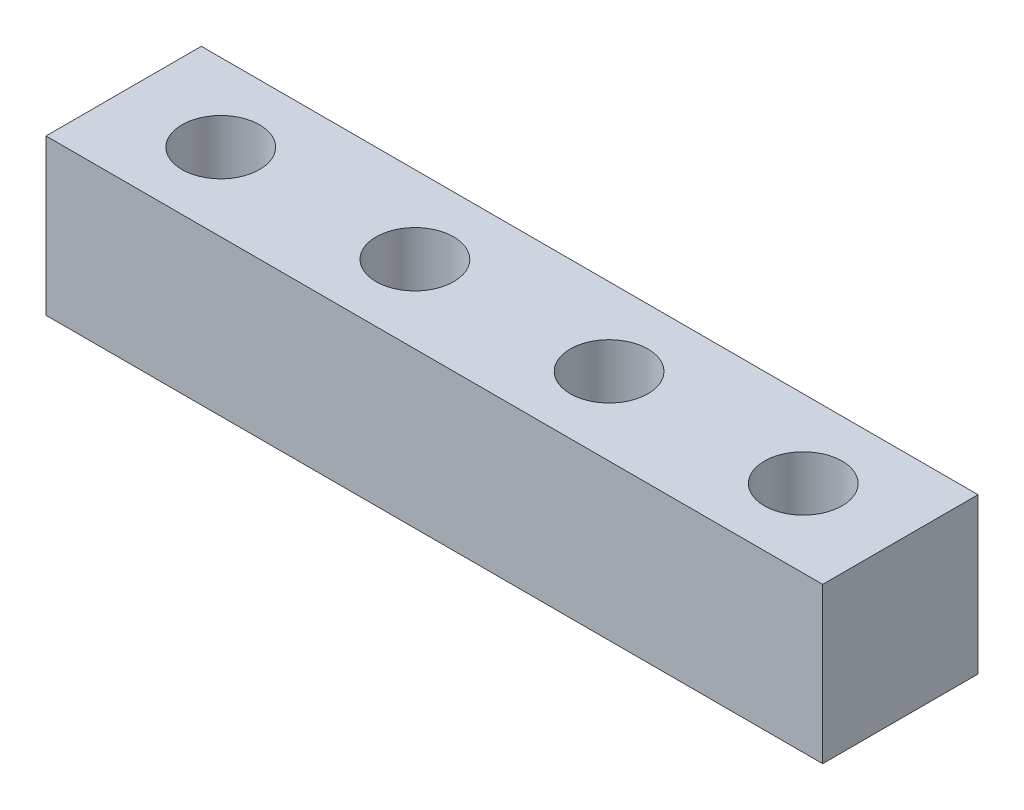
ISO-10303-21;
HEADER;
FILE_DESCRIPTION(('STEP AP214'),'2;1');
FILE_NAME('part.step','',(''),(''),'','','');
FILE_SCHEMA(('AUTOMOTIVE_DESIGN { 1 0 10303 214 1 1 1 1 }'));
ENDSEC;
DATA;
#1=APPLICATION_CONTEXT('core data for automotive mechanical design processes');
#2=APPLICATION_PROTOCOL_DEFINITION('international standard','automotive_design',2000,#1);
#3=PRODUCT_CONTEXT('',#1,'mechanical');
#4=PRODUCT('Part','Part','',(#3));
#5=PRODUCT_RELATED_PRODUCT_CATEGORY('part','',(#4));
#6=PRODUCT_DEFINITION_FORMATION('','',#4);
#7=PRODUCT_DEFINITION_CONTEXT('part definition',#1,'design');
#8=PRODUCT_DEFINITION('design','',#6,#7);
#9=PRODUCT_DEFINITION_SHAPE('','',#8);
#10=(LENGTH_UNIT() NAMED_UNIT(*) SI_UNIT(.MILLI.,.METRE.));
#11=(NAMED_UNIT(*) PLANE_ANGLE_UNIT() SI_UNIT($,.RADIAN.));
#12=(NAMED_UNIT(*) SI_UNIT($,.STERADIAN.) SOLID_ANGLE_UNIT());
#13=UNCERTAINTY_MEASURE_WITH_UNIT(LENGTH_MEASURE(1.E-05),#10,'distance_accuracy_value','');
#14=(GEOMETRIC_REPRESENTATION_CONTEXT(3) GLOBAL_UNCERTAINTY_ASSIGNED_CONTEXT((#13)) GLOBAL_UNIT_ASSIGNED_CONTEXT((#10,
#11,#12)) REPRESENTATION_CONTEXT('',''));
#15=CARTESIAN_POINT('',(0.,0.,0.));
#16=DIRECTION('',(0.,0.,1.));
#17=DIRECTION('',(1.,0.,0.));
#18=AXIS2_PLACEMENT_3D('',#15,#16,#17);
#19=CARTESIAN_POINT('',(0.,3.,0.));
#20=DIRECTION('',(0.,-1.,0.));
#21=DIRECTION('',(0.,0.,-1.));
#22=AXIS2_PLACEMENT_3D('',#19,#20,#21);
#23=PLANE('',#22);
#24=DIRECTION('',(0.,0.,-1.));
#25=VECTOR('',#24,1.);
#26=CARTESIAN_POINT('',(7.5,3.,1.5));
#27=LINE('',#26,#25);
#28=CARTESIAN_POINT('',(7.5,3.,1.5));
#29=VERTEX_POINT('',#28);
#30=CARTESIAN_POINT('',(7.5,3.,-1.5));
#31=VERTEX_POINT('',#30);
#32=EDGE_CURVE('E92',#29,#31,#27,.T.);
#33=ORIENTED_EDGE('',*,*,#32,.T.);
#34=DIRECTION('',(-1.,0.,0.));
#35=VECTOR('',#34,1.);
#36=CARTESIAN_POINT('',(-7.5,3.,-1.5));
#37=LINE('',#36,#35);
#38=CARTESIAN_POINT('',(-7.5,3.,-1.5));
#39=VERTEX_POINT('',#38);
#40=EDGE_CURVE('E87',#31,#39,#37,.T.);
#41=ORIENTED_EDGE('',*,*,#40,.T.);
#42=DIRECTION('',(0.,0.,1.));
#43=VECTOR('',#42,1.);
#44=CARTESIAN_POINT('',(-7.5,3.,1.5));
#45=LINE('',#44,#43);
#46=CARTESIAN_POINT('',(-7.5,3.,1.5));
#47=VERTEX_POINT('',#46);
#48=EDGE_CURVE('E90',#39,#47,#45,.T.);
#49=ORIENTED_EDGE('',*,*,#48,.T.);
#50=DIRECTION('',(1.,0.,0.));
#51=VECTOR('',#50,1.);
#52=CARTESIAN_POINT('',(-7.5,3.,1.5));
#53=LINE('',#52,#51);
#54=EDGE_CURVE('E57',#47,#29,#53,.T.);
#55=ORIENTED_EDGE('',*,*,#54,.T.);
#56=EDGE_LOOP('',(#33,#41,#49,#55));
#57=FACE_BOUND('',#56,.T.);
#58=CARTESIAN_POINT('',(-5.625,3.,0.));
#59=DIRECTION('',(0.,1.,0.));
#60=DIRECTION('',(0.,0.,1.));
#61=AXIS2_PLACEMENT_3D('',#58,#59,#60);
#62=CIRCLE('',#61,0.75);
#63=CARTESIAN_POINT('',(-5.625,3.,0.75));
#64=VERTEX_POINT('',#63);
#65=EDGE_CURVE('E112',#64,#64,#62,.T.);
#66=ORIENTED_EDGE('',*,*,#65,.F.);
#67=EDGE_LOOP('',(#66));
#68=FACE_BOUND('',#67,.T.);
#69=CARTESIAN_POINT('',(-1.875,3.,0.));
#70=DIRECTION('',(0.,1.,0.));
#71=DIRECTION('',(0.,0.,1.));
#72=AXIS2_PLACEMENT_3D('',#69,#70,#71);
#73=CIRCLE('',#72,0.75);
#74=CARTESIAN_POINT('',(-1.875,3.,0.75));
#75=VERTEX_POINT('',#74);
#76=EDGE_CURVE('E134',#75,#75,#73,.T.);
#77=ORIENTED_EDGE('',*,*,#76,.F.);
#78=EDGE_LOOP('',(#77));
#79=FACE_BOUND('',#78,.T.);
#80=CARTESIAN_POINT('',(1.875,3.,0.));
#81=DIRECTION('',(0.,1.,0.));
#82=DIRECTION('',(0.,0.,1.));
#83=AXIS2_PLACEMENT_3D('',#80,#81,#82);
#84=CIRCLE('',#83,0.75);
#85=CARTESIAN_POINT('',(1.875,3.,0.75));
#86=VERTEX_POINT('',#85);
#87=EDGE_CURVE('E142',#86,#86,#84,.T.);
#88=ORIENTED_EDGE('',*,*,#87,.F.);
#89=EDGE_LOOP('',(#88));
#90=FACE_BOUND('',#89,.T.);
#91=CARTESIAN_POINT('',(5.625,3.,0.));
#92=DIRECTION('',(0.,1.,0.));
#93=DIRECTION('',(0.,0.,1.));
#94=AXIS2_PLACEMENT_3D('',#91,#92,#93);
#95=CIRCLE('',#94,0.75);
#96=CARTESIAN_POINT('',(5.625,3.,0.75));
#97=VERTEX_POINT('',#96);
#98=EDGE_CURVE('E150',#97,#97,#95,.T.);
#99=ORIENTED_EDGE('',*,*,#98,.F.);
#100=EDGE_LOOP('',(#99));
#101=FACE_BOUND('',#100,.T.);
#102=ADVANCED_FACE('F39',(#57,#68,#79,#90,#101),#23,.F.);
#103=CARTESIAN_POINT('',(0.,0.,0.));
#104=DIRECTION('',(0.,-1.,0.));
#105=DIRECTION('',(0.,0.,-1.));
#106=AXIS2_PLACEMENT_3D('',#103,#104,#105);
#107=PLANE('',#106);
#108=CARTESIAN_POINT('',(1.875,0.,0.));
#109=DIRECTION('',(0.,1.,0.));
#110=DIRECTION('',(0.,0.,1.));
#111=AXIS2_PLACEMENT_3D('',#108,#109,#110);
#112=CIRCLE('',#111,0.75);
#113=CARTESIAN_POINT('',(1.875,0.,0.75));
#114=VERTEX_POINT('',#113);
#115=EDGE_CURVE('E146',#114,#114,#112,.T.);
#116=ORIENTED_EDGE('',*,*,#115,.T.);
#117=EDGE_LOOP('',(#116));
#118=FACE_BOUND('',#117,.T.);
#119=CARTESIAN_POINT('',(-5.625,0.,0.));
#120=DIRECTION('',(0.,1.,0.));
#121=DIRECTION('',(0.,0.,1.));
#122=AXIS2_PLACEMENT_3D('',#119,#120,#121);
#123=CIRCLE('',#122,0.75);
#124=CARTESIAN_POINT('',(-5.625,0.,0.75));
#125=VERTEX_POINT('',#124);
#126=EDGE_CURVE('E130',#125,#125,#123,.T.);
#127=ORIENTED_EDGE('',*,*,#126,.T.);
#128=EDGE_LOOP('',(#127));
#129=FACE_BOUND('',#128,.T.);
#130=DIRECTION('',(0.,0.,-1.));
#131=VECTOR('',#130,1.);
#132=CARTESIAN_POINT('',(7.5,0.,1.5));
#133=LINE('',#132,#131);
#134=CARTESIAN_POINT('',(7.5,0.,1.5));
#135=VERTEX_POINT('',#134);
#136=CARTESIAN_POINT('',(7.5,0.,-1.5));
#137=VERTEX_POINT('',#136);
#138=EDGE_CURVE('E108',#135,#137,#133,.T.);
#139=ORIENTED_EDGE('',*,*,#138,.F.);
#140=DIRECTION('',(1.,0.,0.));
#141=VECTOR('',#140,1.);
#142=CARTESIAN_POINT('',(-7.5,0.,1.5));
#143=LINE('',#142,#141);
#144=CARTESIAN_POINT('',(-7.5,0.,1.5));
#145=VERTEX_POINT('',#144);
#146=EDGE_CURVE('E80',#145,#135,#143,.T.);
#147=ORIENTED_EDGE('',*,*,#146,.F.);
#148=DIRECTION('',(0.,0.,1.));
#149=VECTOR('',#148,1.);
#150=CARTESIAN_POINT('',(-7.5,0.,1.5));
#151=LINE('',#150,#149);
#152=CARTESIAN_POINT('',(-7.5,0.,-1.5));
#153=VERTEX_POINT('',#152);
#154=EDGE_CURVE('E74',#153,#145,#151,.T.);
#155=ORIENTED_EDGE('',*,*,#154,.F.);
#156=DIRECTION('',(-1.,0.,0.));
#157=VECTOR('',#156,1.);
#158=CARTESIAN_POINT('',(-7.5,0.,-1.5));
#159=LINE('',#158,#157);
#160=EDGE_CURVE('E97',#137,#153,#159,.T.);
#161=ORIENTED_EDGE('',*,*,#160,.F.);
#162=EDGE_LOOP('',(#139,#147,#155,#161));
#163=FACE_BOUND('',#162,.T.);
#164=CARTESIAN_POINT('',(-1.875,0.,0.));
#165=DIRECTION('',(0.,1.,0.));
#166=DIRECTION('',(0.,0.,1.));
#167=AXIS2_PLACEMENT_3D('',#164,#165,#166);
#168=CIRCLE('',#167,0.75);
#169=CARTESIAN_POINT('',(-1.875,0.,0.75));
#170=VERTEX_POINT('',#169);
#171=EDGE_CURVE('E138',#170,#170,#168,.T.);
#172=ORIENTED_EDGE('',*,*,#171,.T.);
#173=EDGE_LOOP('',(#172));
#174=FACE_BOUND('',#173,.T.);
#175=CARTESIAN_POINT('',(5.625,0.,0.));
#176=DIRECTION('',(0.,1.,0.));
#177=DIRECTION('',(0.,0.,1.));
#178=AXIS2_PLACEMENT_3D('',#175,#176,#177);
#179=CIRCLE('',#178,0.75);
#180=CARTESIAN_POINT('',(5.625,0.,0.75));
#181=VERTEX_POINT('',#180);
#182=EDGE_CURVE('E154',#181,#181,#179,.T.);
#183=ORIENTED_EDGE('',*,*,#182,.T.);
#184=EDGE_LOOP('',(#183));
#185=FACE_BOUND('',#184,.T.);
#186=ADVANCED_FACE('F125',(#118,#129,#163,#174,#185),#107,.T.);
#187=CARTESIAN_POINT('',(7.5,3.,1.5));
#188=DIRECTION('',(-1.,0.,0.));
#189=DIRECTION('',(0.,0.,1.));
#190=AXIS2_PLACEMENT_3D('',#187,#188,#189);
#191=PLANE('',#190);
#192=ORIENTED_EDGE('',*,*,#138,.T.);
#193=DIRECTION('',(0.,-1.,0.));
#194=VECTOR('',#193,1.);
#195=CARTESIAN_POINT('',(7.5,3.,-1.5));
#196=LINE('',#195,#194);
#197=EDGE_CURVE('E11',#31,#137,#196,.T.);
#198=ORIENTED_EDGE('',*,*,#197,.F.);
#199=ORIENTED_EDGE('',*,*,#32,.F.);
#200=DIRECTION('',(0.,-1.,0.));
#201=VECTOR('',#200,1.);
#202=CARTESIAN_POINT('',(7.5,3.,1.5));
#203=LINE('',#202,#201);
#204=EDGE_CURVE('E104',#29,#135,#203,.T.);
#205=ORIENTED_EDGE('',*,*,#204,.T.);
#206=EDGE_LOOP('',(#192,#198,#199,#205));
#207=FACE_BOUND('',#206,.T.);
#208=ADVANCED_FACE('F41',(#207),#191,.F.);
#209=CARTESIAN_POINT('',(-7.5,3.,-1.5));
#210=DIRECTION('',(0.,0.,1.));
#211=DIRECTION('',(1.,0.,0.));
#212=AXIS2_PLACEMENT_3D('',#209,#210,#211);
#213=PLANE('',#212);
#214=ORIENTED_EDGE('',*,*,#160,.T.);
#215=DIRECTION('',(0.,-1.,0.));
#216=VECTOR('',#215,1.);
#217=CARTESIAN_POINT('',(-7.5,3.,-1.5));
#218=LINE('',#217,#216);
#219=EDGE_CURVE('E49',#39,#153,#218,.T.);
#220=ORIENTED_EDGE('',*,*,#219,.F.);
#221=ORIENTED_EDGE('',*,*,#40,.F.);
#222=ORIENTED_EDGE('',*,*,#197,.T.);
#223=EDGE_LOOP('',(#214,#220,#221,#222));
#224=FACE_BOUND('',#223,.T.);
#225=ADVANCED_FACE('F96',(#224),#213,.F.);
#226=CARTESIAN_POINT('',(-7.5,3.,1.5));
#227=DIRECTION('',(1.,0.,0.));
#228=DIRECTION('',(0.,0.,-1.));
#229=AXIS2_PLACEMENT_3D('',#226,#227,#228);
#230=PLANE('',#229);
#231=ORIENTED_EDGE('',*,*,#154,.T.);
#232=DIRECTION('',(0.,-1.,0.));
#233=VECTOR('',#232,1.);
#234=CARTESIAN_POINT('',(-7.5,3.,1.5));
#235=LINE('',#234,#233);
#236=EDGE_CURVE('E99',#47,#145,#235,.T.);
#237=ORIENTED_EDGE('',*,*,#236,.F.);
#238=ORIENTED_EDGE('',*,*,#48,.F.);
#239=ORIENTED_EDGE('',*,*,#219,.T.);
#240=EDGE_LOOP('',(#231,#237,#238,#239));
#241=FACE_BOUND('',#240,.T.);
#242=ADVANCED_FACE('F100',(#241),#230,.F.);
#243=CARTESIAN_POINT('',(-7.5,3.,1.5));
#244=DIRECTION('',(0.,0.,-1.));
#245=DIRECTION('',(-1.,0.,0.));
#246=AXIS2_PLACEMENT_3D('',#243,#244,#245);
#247=PLANE('',#246);
#248=ORIENTED_EDGE('',*,*,#146,.T.);
#249=ORIENTED_EDGE('',*,*,#204,.F.);
#250=ORIENTED_EDGE('',*,*,#54,.F.);
#251=ORIENTED_EDGE('',*,*,#236,.T.);
#252=EDGE_LOOP('',(#248,#249,#250,#251));
#253=FACE_BOUND('',#252,.T.);
#254=ADVANCED_FACE('F122',(#253),#247,.F.);
#255=CARTESIAN_POINT('',(-5.625,3.,0.));
#256=DIRECTION('',(0.,-1.,0.));
#257=DIRECTION('',(0.,0.,-1.));
#258=AXIS2_PLACEMENT_3D('',#255,#256,#257);
#259=CYLINDRICAL_SURFACE('',#258,0.75);
#260=ORIENTED_EDGE('',*,*,#65,.T.);
#261=EDGE_LOOP('',(#260));
#262=FACE_BOUND('',#261,.T.);
#263=ORIENTED_EDGE('',*,*,#126,.F.);
#264=EDGE_LOOP('',(#263));
#265=FACE_BOUND('',#264,.T.);
#266=ADVANCED_FACE('F173',(#262,#265),#259,.F.);
#267=CARTESIAN_POINT('',(-1.875,3.,0.));
#268=DIRECTION('',(0.,-1.,0.));
#269=DIRECTION('',(0.,0.,-1.));
#270=AXIS2_PLACEMENT_3D('',#267,#268,#269);
#271=CYLINDRICAL_SURFACE('',#270,0.75);
#272=ORIENTED_EDGE('',*,*,#76,.T.);
#273=EDGE_LOOP('',(#272));
#274=FACE_BOUND('',#273,.T.);
#275=ORIENTED_EDGE('',*,*,#171,.F.);
#276=EDGE_LOOP('',(#275));
#277=FACE_BOUND('',#276,.T.);
#278=ADVANCED_FACE('F219',(#274,#277),#271,.F.);
#279=CARTESIAN_POINT('',(1.875,3.,0.));
#280=DIRECTION('',(0.,-1.,0.));
#281=DIRECTION('',(0.,0.,-1.));
#282=AXIS2_PLACEMENT_3D('',#279,#280,#281);
#283=CYLINDRICAL_SURFACE('',#282,0.75);
#284=ORIENTED_EDGE('',*,*,#87,.T.);
#285=EDGE_LOOP('',(#284));
#286=FACE_BOUND('',#285,.T.);
#287=ORIENTED_EDGE('',*,*,#115,.F.);
#288=EDGE_LOOP('',(#287));
#289=FACE_BOUND('',#288,.T.);
#290=ADVANCED_FACE('F227',(#286,#289),#283,.F.);
#291=CARTESIAN_POINT('',(5.625,3.,0.));
#292=DIRECTION('',(0.,-1.,0.));
#293=DIRECTION('',(0.,0.,-1.));
#294=AXIS2_PLACEMENT_3D('',#291,#292,#293);
#295=CYLINDRICAL_SURFACE('',#294,0.75);
#296=ORIENTED_EDGE('',*,*,#98,.T.);
#297=EDGE_LOOP('',(#296));
#298=FACE_BOUND('',#297,.T.);
#299=ORIENTED_EDGE('',*,*,#182,.F.);
#300=EDGE_LOOP('',(#299));
#301=FACE_BOUND('',#300,.T.);
#302=ADVANCED_FACE('F162',(#298,#301),#295,.F.);
#303=CLOSED_SHELL('',(#102,#186,#208,#225,#242,#254,#266,#278,#290,#302));
#304=MANIFOLD_SOLID_BREP('B2',#303);
#305=ADVANCED_BREP_SHAPE_REPRESENTATION('',(#18,#304),#14);
#306=SHAPE_DEFINITION_REPRESENTATION(#9,#305);
ENDSEC;
END-ISO-10303-21;
